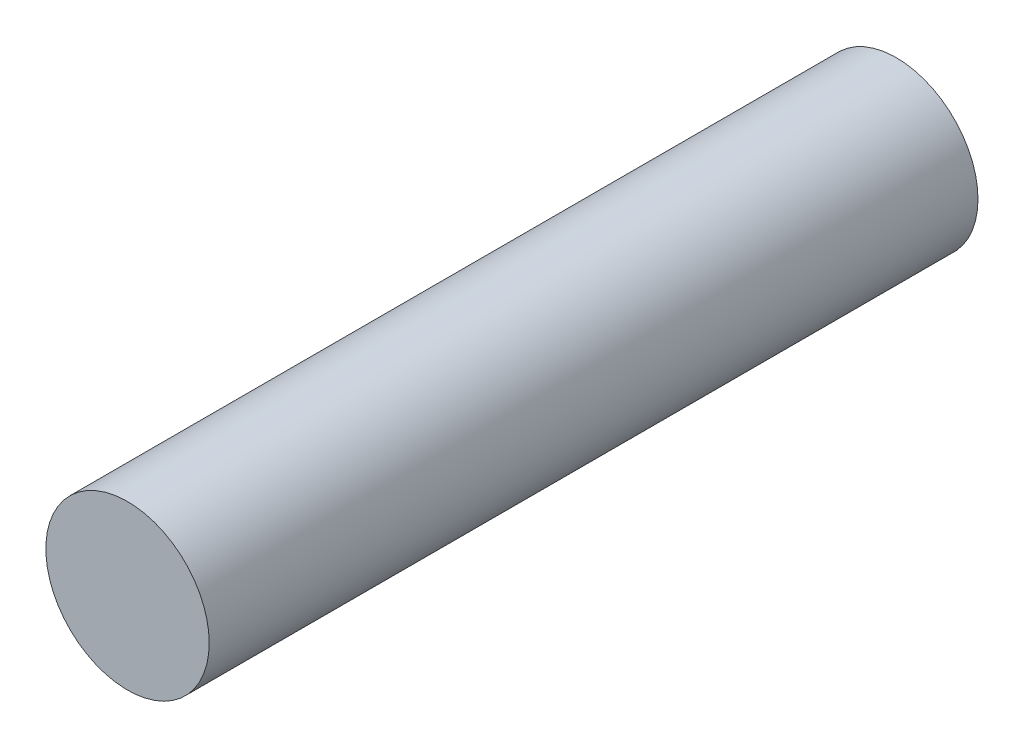
ISO-10303-21;
HEADER;
FILE_DESCRIPTION(('STEP AP214'),'2;1');
FILE_NAME('part.step','',(''),(''),'','','');
FILE_SCHEMA(('AUTOMOTIVE_DESIGN { 1 0 10303 214 1 1 1 1 }'));
ENDSEC;
DATA;
#1=APPLICATION_CONTEXT('core data for automotive mechanical design processes');
#2=APPLICATION_PROTOCOL_DEFINITION('international standard','automotive_design',2000,#1);
#3=PRODUCT_CONTEXT('',#1,'mechanical');
#4=PRODUCT('Part','Part','',(#3));
#5=PRODUCT_RELATED_PRODUCT_CATEGORY('part','',(#4));
#6=PRODUCT_DEFINITION_FORMATION('','',#4);
#7=PRODUCT_DEFINITION_CONTEXT('part definition',#1,'design');
#8=PRODUCT_DEFINITION('design','',#6,#7);
#9=PRODUCT_DEFINITION_SHAPE('','',#8);
#10=(LENGTH_UNIT() NAMED_UNIT(*) SI_UNIT(.MILLI.,.METRE.));
#11=(NAMED_UNIT(*) PLANE_ANGLE_UNIT() SI_UNIT($,.RADIAN.));
#12=(NAMED_UNIT(*) SI_UNIT($,.STERADIAN.) SOLID_ANGLE_UNIT());
#13=UNCERTAINTY_MEASURE_WITH_UNIT(LENGTH_MEASURE(1.E-05),#10,'distance_accuracy_value','');
#14=(GEOMETRIC_REPRESENTATION_CONTEXT(3) GLOBAL_UNCERTAINTY_ASSIGNED_CONTEXT((#13)) GLOBAL_UNIT_ASSIGNED_CONTEXT((#10,
#11,#12)) REPRESENTATION_CONTEXT('',''));
#15=CARTESIAN_POINT('',(0.,0.,0.));
#16=DIRECTION('',(0.,0.,1.));
#17=DIRECTION('',(1.,0.,0.));
#18=AXIS2_PLACEMENT_3D('',#15,#16,#17);
#19=CARTESIAN_POINT('',(0.,0.,8.));
#20=DIRECTION('',(0.,0.,-1.));
#21=DIRECTION('',(-1.,0.,0.));
#22=AXIS2_PLACEMENT_3D('',#19,#20,#21);
#23=CYLINDRICAL_SURFACE('',#22,0.85);
#24=CARTESIAN_POINT('',(0.,0.,8.));
#25=DIRECTION('',(0.,0.,1.));
#26=DIRECTION('',(1.,0.,0.));
#27=AXIS2_PLACEMENT_3D('',#24,#25,#26);
#28=CIRCLE('',#27,0.85);
#29=CARTESIAN_POINT('',(0.85,0.,8.));
#30=VERTEX_POINT('',#29);
#31=EDGE_CURVE('E10',#30,#30,#28,.T.);
#32=ORIENTED_EDGE('',*,*,#31,.F.);
#33=EDGE_LOOP('',(#32));
#34=FACE_BOUND('',#33,.T.);
#35=CARTESIAN_POINT('',(0.,0.,0.));
#36=DIRECTION('',(0.,0.,1.));
#37=DIRECTION('',(1.,0.,0.));
#38=AXIS2_PLACEMENT_3D('',#35,#36,#37);
#39=CIRCLE('',#38,0.85);
#40=CARTESIAN_POINT('',(0.85,0.,0.));
#41=VERTEX_POINT('',#40);
#42=EDGE_CURVE('E46',#41,#41,#39,.T.);
#43=ORIENTED_EDGE('',*,*,#42,.T.);
#44=EDGE_LOOP('',(#43));
#45=FACE_BOUND('',#44,.T.);
#46=ADVANCED_FACE('F43',(#34,#45),#23,.T.);
#47=CARTESIAN_POINT('',(0.,0.,8.));
#48=DIRECTION('',(0.,0.,1.));
#49=DIRECTION('',(1.,0.,0.));
#50=AXIS2_PLACEMENT_3D('',#47,#48,#49);
#51=PLANE('',#50);
#52=ORIENTED_EDGE('',*,*,#31,.T.);
#53=EDGE_LOOP('',(#52));
#54=FACE_BOUND('',#53,.T.);
#55=ADVANCED_FACE('F60',(#54),#51,.T.);
#56=CARTESIAN_POINT('',(0.,0.,0.));
#57=DIRECTION('',(0.,0.,1.));
#58=DIRECTION('',(1.,0.,0.));
#59=AXIS2_PLACEMENT_3D('',#56,#57,#58);
#60=PLANE('',#59);
#61=ORIENTED_EDGE('',*,*,#42,.F.);
#62=EDGE_LOOP('',(#61));
#63=FACE_BOUND('',#62,.T.);
#64=ADVANCED_FACE('F58',(#63),#60,.F.);
#65=CLOSED_SHELL('',(#46,#55,#64));
#66=MANIFOLD_SOLID_BREP('B2',#65);
#67=ADVANCED_BREP_SHAPE_REPRESENTATION('',(#18,#66),#14);
#68=SHAPE_DEFINITION_REPRESENTATION(#9,#67);
ENDSEC;
END-ISO-10303-21;
